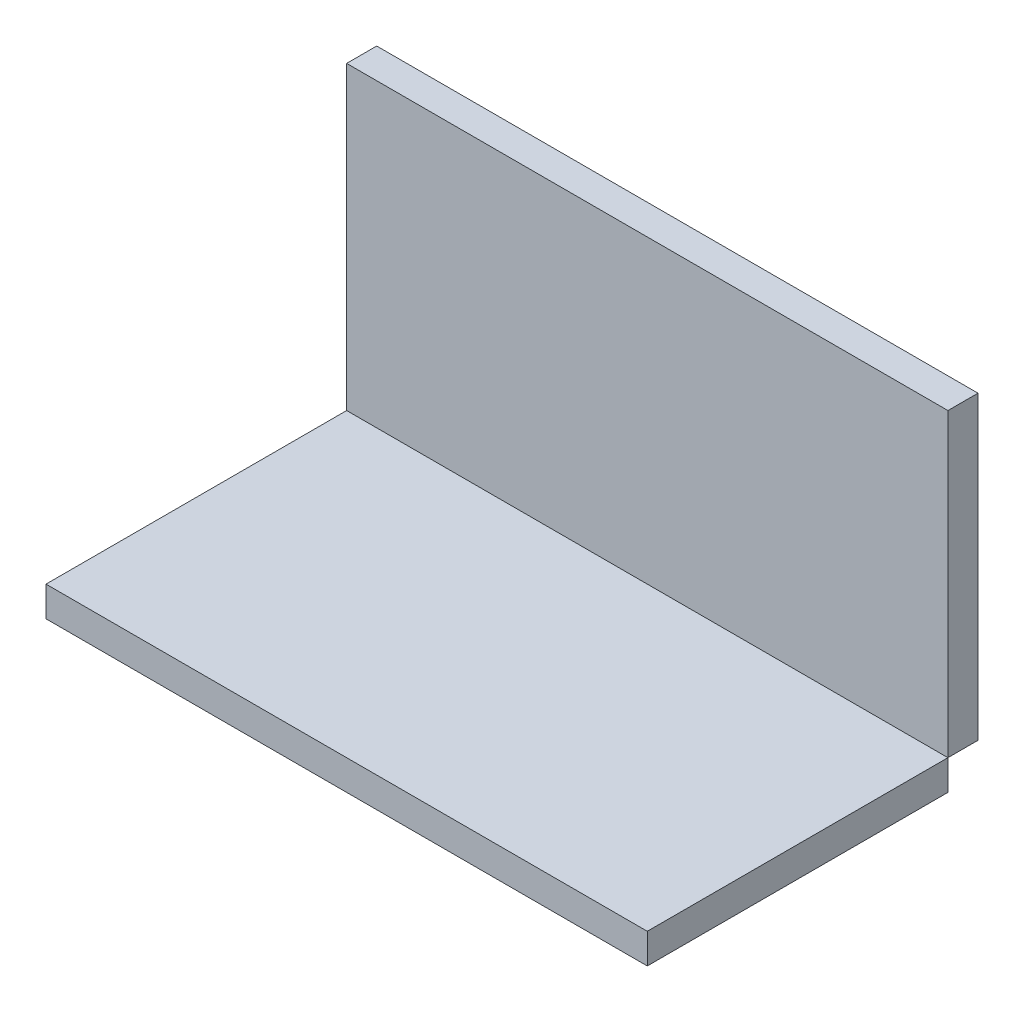
ISO-10303-21;
HEADER;
FILE_DESCRIPTION(('STEP AP214'),'2;1');
FILE_NAME('part.step','',(''),(''),'','','');
FILE_SCHEMA(('AUTOMOTIVE_DESIGN { 1 0 10303 214 1 1 1 1 }'));
ENDSEC;
DATA;
#1=APPLICATION_CONTEXT('core data for automotive mechanical design processes');
#2=APPLICATION_PROTOCOL_DEFINITION('international standard','automotive_design',2000,#1);
#3=PRODUCT_CONTEXT('',#1,'mechanical');
#4=PRODUCT('Part','Part','',(#3));
#5=PRODUCT_RELATED_PRODUCT_CATEGORY('part','',(#4));
#6=PRODUCT_DEFINITION_FORMATION('','',#4);
#7=PRODUCT_DEFINITION_CONTEXT('part definition',#1,'design');
#8=PRODUCT_DEFINITION('design','',#6,#7);
#9=PRODUCT_DEFINITION_SHAPE('','',#8);
#10=(LENGTH_UNIT() NAMED_UNIT(*) SI_UNIT(.MILLI.,.METRE.));
#11=(NAMED_UNIT(*) PLANE_ANGLE_UNIT() SI_UNIT($,.RADIAN.));
#12=(NAMED_UNIT(*) SI_UNIT($,.STERADIAN.) SOLID_ANGLE_UNIT());
#13=UNCERTAINTY_MEASURE_WITH_UNIT(LENGTH_MEASURE(1.E-05),#10,'distance_accuracy_value','');
#14=(GEOMETRIC_REPRESENTATION_CONTEXT(3) GLOBAL_UNCERTAINTY_ASSIGNED_CONTEXT((#13)) GLOBAL_UNIT_ASSIGNED_CONTEXT((#10,
#11,#12)) REPRESENTATION_CONTEXT('',''));
#15=CARTESIAN_POINT('',(0.,0.,0.));
#16=DIRECTION('',(0.,0.,1.));
#17=DIRECTION('',(1.,0.,0.));
#18=AXIS2_PLACEMENT_3D('',#15,#16,#17);
#19=CARTESIAN_POINT('',(20.,0.,0.));
#20=DIRECTION('',(1.,0.,0.));
#21=DIRECTION('',(0.,0.,1.));
#22=AXIS2_PLACEMENT_3D('',#19,#20,#21);
#23=PLANE('',#22);
#24=DIRECTION('',(0.,-1.,0.));
#25=VECTOR('',#24,1.);
#26=CARTESIAN_POINT('',(20.,0.,0.));
#27=LINE('',#26,#25);
#28=CARTESIAN_POINT('',(20.,0.,0.));
#29=VERTEX_POINT('',#28);
#30=CARTESIAN_POINT('',(20.,-1.,0.));
#31=VERTEX_POINT('',#30);
#32=EDGE_CURVE('E12',#29,#31,#27,.T.);
#33=ORIENTED_EDGE('',*,*,#32,.F.);
#34=DIRECTION('',(0.,0.,1.));
#35=VECTOR('',#34,1.);
#36=CARTESIAN_POINT('',(20.,0.,0.));
#37=LINE('',#36,#35);
#38=CARTESIAN_POINT('',(20.,0.,10.));
#39=VERTEX_POINT('',#38);
#40=EDGE_CURVE('E109',#29,#39,#37,.T.);
#41=ORIENTED_EDGE('',*,*,#40,.T.);
#42=DIRECTION('',(0.,-1.,0.));
#43=VECTOR('',#42,1.);
#44=CARTESIAN_POINT('',(20.,0.,10.));
#45=LINE('',#44,#43);
#46=CARTESIAN_POINT('',(20.,-1.,10.));
#47=VERTEX_POINT('',#46);
#48=EDGE_CURVE('E61',#39,#47,#45,.T.);
#49=ORIENTED_EDGE('',*,*,#48,.T.);
#50=DIRECTION('',(0.,0.,-1.));
#51=VECTOR('',#50,1.);
#52=CARTESIAN_POINT('',(20.,-1.,0.));
#53=LINE('',#52,#51);
#54=EDGE_CURVE('E116',#31,#47,#53,.F.);
#55=ORIENTED_EDGE('',*,*,#54,.F.);
#56=EDGE_LOOP('',(#33,#41,#49,#55));
#57=FACE_BOUND('',#56,.T.);
#58=ADVANCED_FACE('F54',(#57),#23,.T.);
#59=CARTESIAN_POINT('',(0.,0.,10.));
#60=DIRECTION('',(0.,0.,-1.));
#61=DIRECTION('',(1.,0.,0.));
#62=AXIS2_PLACEMENT_3D('',#59,#60,#61);
#63=PLANE('',#62);
#64=ORIENTED_EDGE('',*,*,#48,.F.);
#65=DIRECTION('',(1.,0.,0.));
#66=VECTOR('',#65,1.);
#67=CARTESIAN_POINT('',(0.,0.,10.));
#68=LINE('',#67,#66);
#69=CARTESIAN_POINT('',(0.,0.,10.));
#70=VERTEX_POINT('',#69);
#71=EDGE_CURVE('E104',#70,#39,#68,.T.);
#72=ORIENTED_EDGE('',*,*,#71,.F.);
#73=DIRECTION('',(0.,-1.,0.));
#74=VECTOR('',#73,1.);
#75=CARTESIAN_POINT('',(0.,0.,10.));
#76=LINE('',#75,#74);
#77=CARTESIAN_POINT('',(0.,-1.,10.));
#78=VERTEX_POINT('',#77);
#79=EDGE_CURVE('E71',#70,#78,#76,.T.);
#80=ORIENTED_EDGE('',*,*,#79,.T.);
#81=DIRECTION('',(1.,0.,0.));
#82=VECTOR('',#81,1.);
#83=CARTESIAN_POINT('',(0.,-1.,10.));
#84=LINE('',#83,#82);
#85=EDGE_CURVE('E123',#78,#47,#84,.T.);
#86=ORIENTED_EDGE('',*,*,#85,.T.);
#87=EDGE_LOOP('',(#64,#72,#80,#86));
#88=FACE_BOUND('',#87,.T.);
#89=ADVANCED_FACE('F108',(#88),#63,.F.);
#90=CARTESIAN_POINT('',(0.,0.,10.));
#91=DIRECTION('',(-1.,0.,0.));
#92=DIRECTION('',(0.,0.,-1.));
#93=AXIS2_PLACEMENT_3D('',#90,#91,#92);
#94=PLANE('',#93);
#95=ORIENTED_EDGE('',*,*,#79,.F.);
#96=DIRECTION('',(0.,0.,-1.));
#97=VECTOR('',#96,1.);
#98=CARTESIAN_POINT('',(0.,0.,10.));
#99=LINE('',#98,#97);
#100=CARTESIAN_POINT('',(0.,0.,0.));
#101=VERTEX_POINT('',#100);
#102=EDGE_CURVE('E92',#70,#101,#99,.T.);
#103=ORIENTED_EDGE('',*,*,#102,.T.);
#104=DIRECTION('',(0.,-1.,0.));
#105=VECTOR('',#104,1.);
#106=CARTESIAN_POINT('',(0.,0.,0.));
#107=LINE('',#106,#105);
#108=CARTESIAN_POINT('',(0.,-1.,0.));
#109=VERTEX_POINT('',#108);
#110=EDGE_CURVE('E56',#101,#109,#107,.T.);
#111=ORIENTED_EDGE('',*,*,#110,.T.);
#112=DIRECTION('',(0.,0.,-1.));
#113=VECTOR('',#112,1.);
#114=CARTESIAN_POINT('',(0.,-1.,0.));
#115=LINE('',#114,#113);
#116=EDGE_CURVE('E100',#78,#109,#115,.T.);
#117=ORIENTED_EDGE('',*,*,#116,.F.);
#118=EDGE_LOOP('',(#95,#103,#111,#117));
#119=FACE_BOUND('',#118,.T.);
#120=ADVANCED_FACE('F94',(#119),#94,.T.);
#121=CARTESIAN_POINT('',(0.,0.,0.));
#122=DIRECTION('',(0.,0.,-1.));
#123=DIRECTION('',(1.,0.,0.));
#124=AXIS2_PLACEMENT_3D('',#121,#122,#123);
#125=PLANE('',#124);
#126=DIRECTION('',(1.,0.,0.));
#127=VECTOR('',#126,1.);
#128=CARTESIAN_POINT('',(0.,0.,0.));
#129=LINE('',#128,#127);
#130=EDGE_CURVE('E110',#101,#29,#129,.T.);
#131=ORIENTED_EDGE('',*,*,#130,.T.);
#132=ORIENTED_EDGE('',*,*,#32,.T.);
#133=DIRECTION('',(1.,0.,0.));
#134=VECTOR('',#133,1.);
#135=CARTESIAN_POINT('',(0.,-1.,0.));
#136=LINE('',#135,#134);
#137=EDGE_CURVE('E115',#109,#31,#136,.T.);
#138=ORIENTED_EDGE('',*,*,#137,.F.);
#139=ORIENTED_EDGE('',*,*,#110,.F.);
#140=EDGE_LOOP('',(#131,#132,#138,#139));
#141=FACE_BOUND('',#140,.T.);
#142=ADVANCED_FACE('F60',(#141),#125,.T.);
#143=CARTESIAN_POINT('',(0.,-1.,0.));
#144=DIRECTION('',(0.,-1.,0.));
#145=DIRECTION('',(0.,0.,-1.));
#146=AXIS2_PLACEMENT_3D('',#143,#144,#145);
#147=PLANE('',#146);
#148=ORIENTED_EDGE('',*,*,#116,.T.);
#149=ORIENTED_EDGE('',*,*,#137,.T.);
#150=ORIENTED_EDGE('',*,*,#54,.T.);
#151=ORIENTED_EDGE('',*,*,#85,.F.);
#152=EDGE_LOOP('',(#148,#149,#150,#151));
#153=FACE_BOUND('',#152,.T.);
#154=ADVANCED_FACE('F124',(#153),#147,.T.);
#155=CARTESIAN_POINT('',(0.,0.,0.));
#156=DIRECTION('',(0.,-1.,0.));
#157=DIRECTION('',(0.,0.,-1.));
#158=AXIS2_PLACEMENT_3D('',#155,#156,#157);
#159=PLANE('',#158);
#160=ORIENTED_EDGE('',*,*,#102,.F.);
#161=ORIENTED_EDGE('',*,*,#71,.T.);
#162=ORIENTED_EDGE('',*,*,#40,.F.);
#163=ORIENTED_EDGE('',*,*,#130,.F.);
#164=EDGE_LOOP('',(#160,#161,#162,#163));
#165=FACE_BOUND('',#164,.T.);
#166=ADVANCED_FACE('F103',(#165),#159,.F.);
#167=CLOSED_SHELL('',(#58,#89,#120,#142,#154,#166));
#168=MANIFOLD_SOLID_BREP('B2',#167);
#169=CARTESIAN_POINT('',(0.,0.,-1.));
#170=DIRECTION('',(-1.,0.,0.));
#171=DIRECTION('',(0.,0.,1.));
#172=AXIS2_PLACEMENT_3D('',#169,#170,#171);
#173=PLANE('',#172);
#174=DIRECTION('',(0.,-1.,0.));
#175=VECTOR('',#174,1.);
#176=CARTESIAN_POINT('',(0.,0.,0.));
#177=LINE('',#176,#175);
#178=CARTESIAN_POINT('',(0.,10.,0.));
#179=VERTEX_POINT('',#178);
#180=CARTESIAN_POINT('',(0.,0.,0.));
#181=VERTEX_POINT('',#180);
#182=EDGE_CURVE('E254',#179,#181,#177,.T.);
#183=ORIENTED_EDGE('',*,*,#182,.F.);
#184=DIRECTION('',(0.,0.,1.));
#185=VECTOR('',#184,1.);
#186=CARTESIAN_POINT('',(0.,10.,-1.));
#187=LINE('',#186,#185);
#188=CARTESIAN_POINT('',(0.,10.,-1.));
#189=VERTEX_POINT('',#188);
#190=EDGE_CURVE('E52',#189,#179,#187,.T.);
#191=ORIENTED_EDGE('',*,*,#190,.F.);
#192=DIRECTION('',(0.,-1.,0.));
#193=VECTOR('',#192,1.);
#194=CARTESIAN_POINT('',(0.,0.,-1.));
#195=LINE('',#194,#193);
#196=CARTESIAN_POINT('',(0.,0.,-1.));
#197=VERTEX_POINT('',#196);
#198=EDGE_CURVE('E248',#189,#197,#195,.T.);
#199=ORIENTED_EDGE('',*,*,#198,.T.);
#200=DIRECTION('',(0.,0.,1.));
#201=VECTOR('',#200,1.);
#202=CARTESIAN_POINT('',(0.,0.,-1.));
#203=LINE('',#202,#201);
#204=EDGE_CURVE('E193',#197,#181,#203,.T.);
#205=ORIENTED_EDGE('',*,*,#204,.T.);
#206=EDGE_LOOP('',(#183,#191,#199,#205));
#207=FACE_BOUND('',#206,.T.);
#208=ADVANCED_FACE('F191',(#207),#173,.T.);
#209=CARTESIAN_POINT('',(0.,10.,-1.));
#210=DIRECTION('',(0.,1.,0.));
#211=DIRECTION('',(0.,0.,1.));
#212=AXIS2_PLACEMENT_3D('',#209,#210,#211);
#213=PLANE('',#212);
#214=DIRECTION('',(-1.,0.,0.));
#215=VECTOR('',#214,1.);
#216=CARTESIAN_POINT('',(0.,10.,0.));
#217=LINE('',#216,#215);
#218=CARTESIAN_POINT('',(20.,10.,0.));
#219=VERTEX_POINT('',#218);
#220=EDGE_CURVE('E253',#219,#179,#217,.T.);
#221=ORIENTED_EDGE('',*,*,#220,.F.);
#222=DIRECTION('',(0.,0.,1.));
#223=VECTOR('',#222,1.);
#224=CARTESIAN_POINT('',(20.,10.,-1.));
#225=LINE('',#224,#223);
#226=CARTESIAN_POINT('',(20.,10.,-1.));
#227=VERTEX_POINT('',#226);
#228=EDGE_CURVE('E199',#227,#219,#225,.T.);
#229=ORIENTED_EDGE('',*,*,#228,.F.);
#230=DIRECTION('',(-1.,0.,0.));
#231=VECTOR('',#230,1.);
#232=CARTESIAN_POINT('',(0.,10.,-1.));
#233=LINE('',#232,#231);
#234=EDGE_CURVE('E246',#227,#189,#233,.T.);
#235=ORIENTED_EDGE('',*,*,#234,.T.);
#236=ORIENTED_EDGE('',*,*,#190,.T.);
#237=EDGE_LOOP('',(#221,#229,#235,#236));
#238=FACE_BOUND('',#237,.T.);
#239=ADVANCED_FACE('F264',(#238),#213,.T.);
#240=CARTESIAN_POINT('',(20.,0.,-1.));
#241=DIRECTION('',(1.,0.,0.));
#242=DIRECTION('',(0.,0.,-1.));
#243=AXIS2_PLACEMENT_3D('',#240,#241,#242);
#244=PLANE('',#243);
#245=DIRECTION('',(0.,1.,0.));
#246=VECTOR('',#245,1.);
#247=CARTESIAN_POINT('',(20.,0.,0.));
#248=LINE('',#247,#246);
#249=CARTESIAN_POINT('',(20.,0.,0.));
#250=VERTEX_POINT('',#249);
#251=EDGE_CURVE('E243',#250,#219,#248,.T.);
#252=ORIENTED_EDGE('',*,*,#251,.F.);
#253=DIRECTION('',(0.,0.,1.));
#254=VECTOR('',#253,1.);
#255=CARTESIAN_POINT('',(20.,0.,-1.));
#256=LINE('',#255,#254);
#257=CARTESIAN_POINT('',(20.,0.,-1.));
#258=VERTEX_POINT('',#257);
#259=EDGE_CURVE('E237',#258,#250,#256,.T.);
#260=ORIENTED_EDGE('',*,*,#259,.F.);
#261=DIRECTION('',(0.,1.,0.));
#262=VECTOR('',#261,1.);
#263=CARTESIAN_POINT('',(20.,0.,-1.));
#264=LINE('',#263,#262);
#265=EDGE_CURVE('E239',#258,#227,#264,.T.);
#266=ORIENTED_EDGE('',*,*,#265,.T.);
#267=ORIENTED_EDGE('',*,*,#228,.T.);
#268=EDGE_LOOP('',(#252,#260,#266,#267));
#269=FACE_BOUND('',#268,.T.);
#270=ADVANCED_FACE('F236',(#269),#244,.T.);
#271=CARTESIAN_POINT('',(0.,0.,-1.));
#272=DIRECTION('',(0.,-1.,0.));
#273=DIRECTION('',(0.,0.,-1.));
#274=AXIS2_PLACEMENT_3D('',#271,#272,#273);
#275=PLANE('',#274);
#276=DIRECTION('',(1.,0.,0.));
#277=VECTOR('',#276,1.);
#278=CARTESIAN_POINT('',(0.,0.,0.));
#279=LINE('',#278,#277);
#280=EDGE_CURVE('E256',#181,#250,#279,.T.);
#281=ORIENTED_EDGE('',*,*,#280,.F.);
#282=ORIENTED_EDGE('',*,*,#204,.F.);
#283=DIRECTION('',(1.,0.,0.));
#284=VECTOR('',#283,1.);
#285=CARTESIAN_POINT('',(0.,0.,-1.));
#286=LINE('',#285,#284);
#287=EDGE_CURVE('E241',#197,#258,#286,.T.);
#288=ORIENTED_EDGE('',*,*,#287,.T.);
#289=ORIENTED_EDGE('',*,*,#259,.T.);
#290=EDGE_LOOP('',(#281,#282,#288,#289));
#291=FACE_BOUND('',#290,.T.);
#292=ADVANCED_FACE('F249',(#291),#275,.T.);
#293=CARTESIAN_POINT('',(0.,0.,-1.));
#294=DIRECTION('',(0.,0.,-1.));
#295=DIRECTION('',(-1.,0.,0.));
#296=AXIS2_PLACEMENT_3D('',#293,#294,#295);
#297=PLANE('',#296);
#298=ORIENTED_EDGE('',*,*,#198,.F.);
#299=ORIENTED_EDGE('',*,*,#234,.F.);
#300=ORIENTED_EDGE('',*,*,#265,.F.);
#301=ORIENTED_EDGE('',*,*,#287,.F.);
#302=EDGE_LOOP('',(#298,#299,#300,#301));
#303=FACE_BOUND('',#302,.T.);
#304=ADVANCED_FACE('F245',(#303),#297,.T.);
#305=CARTESIAN_POINT('',(0.,0.,0.));
#306=DIRECTION('',(0.,0.,-1.));
#307=DIRECTION('',(-1.,0.,0.));
#308=AXIS2_PLACEMENT_3D('',#305,#306,#307);
#309=PLANE('',#308);
#310=ORIENTED_EDGE('',*,*,#182,.T.);
#311=ORIENTED_EDGE('',*,*,#280,.T.);
#312=ORIENTED_EDGE('',*,*,#251,.T.);
#313=ORIENTED_EDGE('',*,*,#220,.T.);
#314=EDGE_LOOP('',(#310,#311,#312,#313));
#315=FACE_BOUND('',#314,.T.);
#316=ADVANCED_FACE('F262',(#315),#309,.F.);
#317=CLOSED_SHELL('',(#208,#239,#270,#292,#304,#316));
#318=MANIFOLD_SOLID_BREP('B6',#317);
#319=ADVANCED_BREP_SHAPE_REPRESENTATION('',(#18,#168,#318),#14);
#320=SHAPE_DEFINITION_REPRESENTATION(#9,#319);
ENDSEC;
END-ISO-10303-21;
